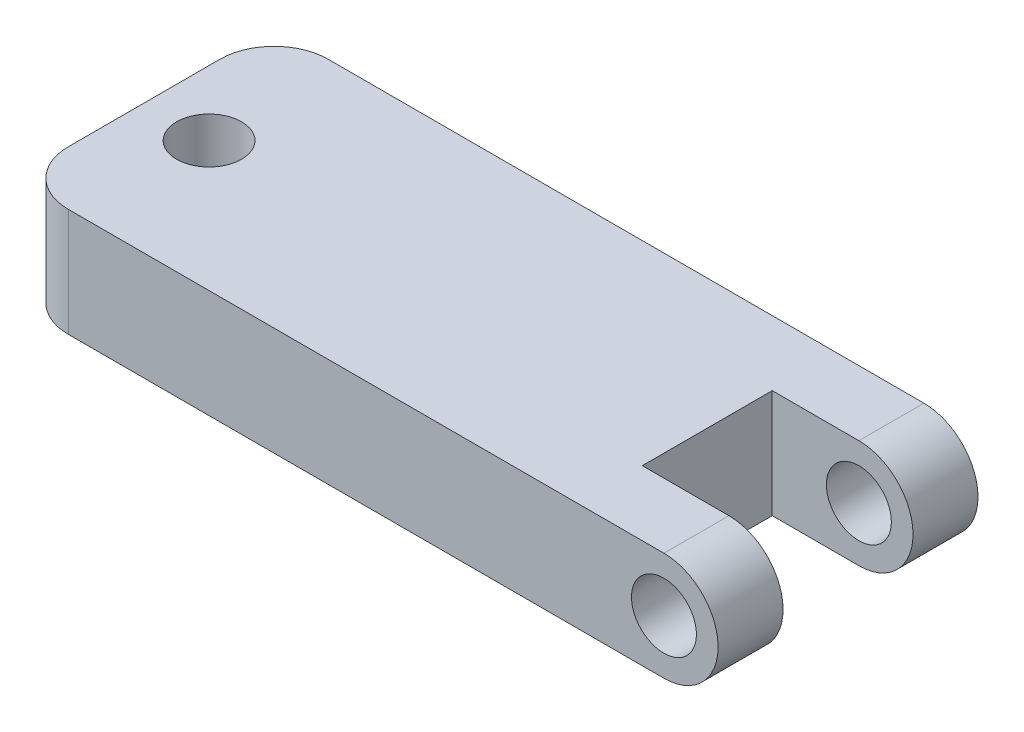
ISO-10303-21;
HEADER;
FILE_DESCRIPTION(('STEP AP214'),'2;1');
FILE_NAME('part.step','',(''),(''),'','','');
FILE_SCHEMA(('AUTOMOTIVE_DESIGN { 1 0 10303 214 1 1 1 1 }'));
ENDSEC;
DATA;
#1=APPLICATION_CONTEXT('core data for automotive mechanical design processes');
#2=APPLICATION_PROTOCOL_DEFINITION('international standard','automotive_design',2000,#1);
#3=PRODUCT_CONTEXT('',#1,'mechanical');
#4=PRODUCT('Part','Part','',(#3));
#5=PRODUCT_RELATED_PRODUCT_CATEGORY('part','',(#4));
#6=PRODUCT_DEFINITION_FORMATION('','',#4);
#7=PRODUCT_DEFINITION_CONTEXT('part definition',#1,'design');
#8=PRODUCT_DEFINITION('design','',#6,#7);
#9=PRODUCT_DEFINITION_SHAPE('','',#8);
#10=(LENGTH_UNIT() NAMED_UNIT(*) SI_UNIT(.MILLI.,.METRE.));
#11=(NAMED_UNIT(*) PLANE_ANGLE_UNIT() SI_UNIT($,.RADIAN.));
#12=(NAMED_UNIT(*) SI_UNIT($,.STERADIAN.) SOLID_ANGLE_UNIT());
#13=UNCERTAINTY_MEASURE_WITH_UNIT(LENGTH_MEASURE(1.E-05),#10,'distance_accuracy_value','');
#14=(GEOMETRIC_REPRESENTATION_CONTEXT(3) GLOBAL_UNCERTAINTY_ASSIGNED_CONTEXT((#13)) GLOBAL_UNIT_ASSIGNED_CONTEXT((#10,
#11,#12)) REPRESENTATION_CONTEXT('',''));
#15=CARTESIAN_POINT('',(0.,0.,0.));
#16=DIRECTION('',(0.,0.,1.));
#17=DIRECTION('',(1.,0.,0.));
#18=AXIS2_PLACEMENT_3D('',#15,#16,#17);
#19=CARTESIAN_POINT('',(30.,2.5,-12.));
#20=DIRECTION('',(0.,0.,1.));
#21=DIRECTION('',(1.,0.,0.));
#22=AXIS2_PLACEMENT_3D('',#19,#20,#21);
#23=CYLINDRICAL_SURFACE('',#22,2.5);
#24=CARTESIAN_POINT('',(30.,2.5,-9.));
#25=DIRECTION('',(0.,0.,-1.));
#26=DIRECTION('',(-1.,0.,0.));
#27=AXIS2_PLACEMENT_3D('',#24,#25,#26);
#28=CIRCLE('',#27,2.5);
#29=CARTESIAN_POINT('',(30.,0.,-9.));
#30=VERTEX_POINT('',#29);
#31=CARTESIAN_POINT('',(30.,5.,-9.));
#32=VERTEX_POINT('',#31);
#33=EDGE_CURVE('E154',#30,#32,#28,.F.);
#34=ORIENTED_EDGE('',*,*,#33,.F.);
#35=DIRECTION('',(0.,0.,1.));
#36=VECTOR('',#35,1.);
#37=CARTESIAN_POINT('',(30.,0.,-12.));
#38=LINE('',#37,#36);
#39=CARTESIAN_POINT('',(30.,0.,-12.));
#40=VERTEX_POINT('',#39);
#41=EDGE_CURVE('E177',#40,#30,#38,.T.);
#42=ORIENTED_EDGE('',*,*,#41,.F.);
#43=CARTESIAN_POINT('',(30.,2.5,-12.));
#44=DIRECTION('',(0.,0.,1.));
#45=DIRECTION('',(1.,0.,0.));
#46=AXIS2_PLACEMENT_3D('',#43,#44,#45);
#47=CIRCLE('',#46,2.5);
#48=CARTESIAN_POINT('',(30.,5.,-12.));
#49=VERTEX_POINT('',#48);
#50=EDGE_CURVE('E159',#40,#49,#47,.T.);
#51=ORIENTED_EDGE('',*,*,#50,.T.);
#52=DIRECTION('',(0.,0.,1.));
#53=VECTOR('',#52,1.);
#54=CARTESIAN_POINT('',(30.,5.,-12.));
#55=LINE('',#54,#53);
#56=EDGE_CURVE('E173',#49,#32,#55,.T.);
#57=ORIENTED_EDGE('',*,*,#56,.T.);
#58=EDGE_LOOP('',(#34,#42,#51,#57));
#59=FACE_BOUND('',#58,.T.);
#60=ADVANCED_FACE('F35',(#59),#23,.T.);
#61=CARTESIAN_POINT('',(0.,5.,-12.));
#62=DIRECTION('',(-1.,0.,0.));
#63=DIRECTION('',(0.,0.,1.));
#64=AXIS2_PLACEMENT_3D('',#61,#62,#63);
#65=PLANE('',#64);
#66=DIRECTION('',(0.,0.,1.));
#67=VECTOR('',#66,1.);
#68=CARTESIAN_POINT('',(0.,5.,-12.));
#69=LINE('',#68,#67);
#70=CARTESIAN_POINT('',(0.,5.,-9.5));
#71=VERTEX_POINT('',#70);
#72=CARTESIAN_POINT('',(0.,5.,-2.5));
#73=VERTEX_POINT('',#72);
#74=EDGE_CURVE('E171',#71,#73,#69,.T.);
#75=ORIENTED_EDGE('',*,*,#74,.F.);
#76=DIRECTION('',(0.,-1.,0.));
#77=VECTOR('',#76,1.);
#78=CARTESIAN_POINT('',(0.,0.,-9.5));
#79=LINE('',#78,#77);
#80=CARTESIAN_POINT('',(0.,0.,-9.5));
#81=VERTEX_POINT('',#80);
#82=EDGE_CURVE('E189',#71,#81,#79,.T.);
#83=ORIENTED_EDGE('',*,*,#82,.T.);
#84=DIRECTION('',(0.,0.,1.));
#85=VECTOR('',#84,1.);
#86=CARTESIAN_POINT('',(0.,0.,-12.));
#87=LINE('',#86,#85);
#88=CARTESIAN_POINT('',(0.,0.,-2.5));
#89=VERTEX_POINT('',#88);
#90=EDGE_CURVE('E165',#81,#89,#87,.T.);
#91=ORIENTED_EDGE('',*,*,#90,.T.);
#92=DIRECTION('',(0.,-1.,0.));
#93=VECTOR('',#92,1.);
#94=CARTESIAN_POINT('',(0.,5.,-2.5));
#95=LINE('',#94,#93);
#96=EDGE_CURVE('E183',#89,#73,#95,.F.);
#97=ORIENTED_EDGE('',*,*,#96,.T.);
#98=EDGE_LOOP('',(#75,#83,#91,#97));
#99=FACE_BOUND('',#98,.T.);
#100=ADVANCED_FACE('F203',(#99),#65,.T.);
#101=CARTESIAN_POINT('',(30.,5.,-12.));
#102=DIRECTION('',(0.,1.,0.));
#103=DIRECTION('',(0.,0.,1.));
#104=AXIS2_PLACEMENT_3D('',#101,#102,#103);
#105=PLANE('',#104);
#106=CARTESIAN_POINT('',(3.,5.,-6.));
#107=DIRECTION('',(0.,1.,0.));
#108=DIRECTION('',(0.,0.,1.));
#109=AXIS2_PLACEMENT_3D('',#106,#107,#108);
#110=CIRCLE('',#109,1.5);
#111=CARTESIAN_POINT('',(3.,5.,-4.5));
#112=VERTEX_POINT('',#111);
#113=EDGE_CURVE('E275',#112,#112,#110,.T.);
#114=ORIENTED_EDGE('',*,*,#113,.F.);
#115=EDGE_LOOP('',(#114));
#116=FACE_BOUND('',#115,.T.);
#117=DIRECTION('',(-1.,0.,0.));
#118=VECTOR('',#117,1.);
#119=CARTESIAN_POINT('',(30.,5.,-12.));
#120=LINE('',#119,#118);
#121=CARTESIAN_POINT('',(2.5,5.,-12.));
#122=VERTEX_POINT('',#121);
#123=EDGE_CURVE('E163',#49,#122,#120,.T.);
#124=ORIENTED_EDGE('',*,*,#123,.T.);
#125=CARTESIAN_POINT('',(2.5,5.,-9.5));
#126=DIRECTION('',(0.,1.,0.));
#127=DIRECTION('',(0.,0.,1.));
#128=AXIS2_PLACEMENT_3D('',#125,#126,#127);
#129=CIRCLE('',#128,2.5);
#130=EDGE_CURVE('E43',#122,#71,#129,.T.);
#131=ORIENTED_EDGE('',*,*,#130,.T.);
#132=ORIENTED_EDGE('',*,*,#74,.T.);
#133=CARTESIAN_POINT('',(2.5,5.,-2.5));
#134=DIRECTION('',(0.,1.,0.));
#135=DIRECTION('',(0.,0.,1.));
#136=AXIS2_PLACEMENT_3D('',#133,#134,#135);
#137=CIRCLE('',#136,2.5);
#138=CARTESIAN_POINT('',(2.5,5.,0.));
#139=VERTEX_POINT('',#138);
#140=EDGE_CURVE('E50',#73,#139,#137,.T.);
#141=ORIENTED_EDGE('',*,*,#140,.T.);
#142=DIRECTION('',(-1.,0.,0.));
#143=VECTOR('',#142,1.);
#144=CARTESIAN_POINT('',(30.,5.,0.));
#145=LINE('',#144,#143);
#146=CARTESIAN_POINT('',(30.,5.,0.));
#147=VERTEX_POINT('',#146);
#148=EDGE_CURVE('E160',#147,#139,#145,.T.);
#149=ORIENTED_EDGE('',*,*,#148,.F.);
#150=CARTESIAN_POINT('',(30.,5.,-3.));
#151=VERTEX_POINT('',#150);
#152=EDGE_CURVE('E176',#151,#147,#55,.T.);
#153=ORIENTED_EDGE('',*,*,#152,.F.);
#154=DIRECTION('',(1.,0.,0.));
#155=VECTOR('',#154,1.);
#156=CARTESIAN_POINT('',(26.,5.,-3.));
#157=LINE('',#156,#155);
#158=CARTESIAN_POINT('',(26.,5.,-3.));
#159=VERTEX_POINT('',#158);
#160=EDGE_CURVE('E144',#159,#151,#157,.T.);
#161=ORIENTED_EDGE('',*,*,#160,.F.);
#162=DIRECTION('',(0.,0.,1.));
#163=VECTOR('',#162,1.);
#164=CARTESIAN_POINT('',(26.,5.,-9.));
#165=LINE('',#164,#163);
#166=CARTESIAN_POINT('',(26.,5.,-9.));
#167=VERTEX_POINT('',#166);
#168=EDGE_CURVE('E124',#167,#159,#165,.T.);
#169=ORIENTED_EDGE('',*,*,#168,.F.);
#170=DIRECTION('',(-1.,0.,0.));
#171=VECTOR('',#170,1.);
#172=CARTESIAN_POINT('',(26.,5.,-9.));
#173=LINE('',#172,#171);
#174=EDGE_CURVE('E142',#32,#167,#173,.T.);
#175=ORIENTED_EDGE('',*,*,#174,.F.);
#176=ORIENTED_EDGE('',*,*,#56,.F.);
#177=EDGE_LOOP('',(#124,#131,#132,#141,#149,#153,#161,#169,#175,#176));
#178=FACE_BOUND('',#177,.T.);
#179=ADVANCED_FACE('F199',(#116,#178),#105,.T.);
#180=CARTESIAN_POINT('',(30.,2.5,-3.));
#181=DIRECTION('',(0.,0.,1.));
#182=DIRECTION('',(1.,0.,0.));
#183=AXIS2_PLACEMENT_3D('',#180,#181,#182);
#184=CIRCLE('',#183,2.5);
#185=CARTESIAN_POINT('',(30.,0.,-3.));
#186=VERTEX_POINT('',#185);
#187=EDGE_CURVE('E133',#151,#186,#184,.F.);
#188=ORIENTED_EDGE('',*,*,#187,.F.);
#189=ORIENTED_EDGE('',*,*,#152,.T.);
#190=CARTESIAN_POINT('',(30.,2.5,0.));
#191=DIRECTION('',(0.,0.,1.));
#192=DIRECTION('',(1.,0.,0.));
#193=AXIS2_PLACEMENT_3D('',#190,#191,#192);
#194=CIRCLE('',#193,2.5);
#195=CARTESIAN_POINT('',(30.,0.,0.));
#196=VERTEX_POINT('',#195);
#197=EDGE_CURVE('E167',#196,#147,#194,.T.);
#198=ORIENTED_EDGE('',*,*,#197,.F.);
#199=EDGE_CURVE('E179',#186,#196,#38,.T.);
#200=ORIENTED_EDGE('',*,*,#199,.F.);
#201=EDGE_LOOP('',(#188,#189,#198,#200));
#202=FACE_BOUND('',#201,.T.);
#203=ADVANCED_FACE('F217',(#202),#23,.T.);
#204=CARTESIAN_POINT('',(0.,0.,-12.));
#205=DIRECTION('',(0.,-1.,0.));
#206=DIRECTION('',(0.,0.,-1.));
#207=AXIS2_PLACEMENT_3D('',#204,#205,#206);
#208=PLANE('',#207);
#209=CARTESIAN_POINT('',(3.,0.,-6.));
#210=DIRECTION('',(0.,1.,0.));
#211=DIRECTION('',(0.,0.,1.));
#212=AXIS2_PLACEMENT_3D('',#209,#210,#211);
#213=CIRCLE('',#212,1.5);
#214=CARTESIAN_POINT('',(3.,0.,-4.5));
#215=VERTEX_POINT('',#214);
#216=EDGE_CURVE('E273',#215,#215,#213,.T.);
#217=ORIENTED_EDGE('',*,*,#216,.T.);
#218=EDGE_LOOP('',(#217));
#219=FACE_BOUND('',#218,.T.);
#220=ORIENTED_EDGE('',*,*,#90,.F.);
#221=CARTESIAN_POINT('',(2.5,0.,-9.5));
#222=DIRECTION('',(0.,-1.,0.));
#223=DIRECTION('',(0.,0.,-1.));
#224=AXIS2_PLACEMENT_3D('',#221,#222,#223);
#225=CIRCLE('',#224,2.5);
#226=CARTESIAN_POINT('',(2.5,0.,-12.));
#227=VERTEX_POINT('',#226);
#228=EDGE_CURVE('E194',#81,#227,#225,.T.);
#229=ORIENTED_EDGE('',*,*,#228,.T.);
#230=DIRECTION('',(1.,0.,0.));
#231=VECTOR('',#230,1.);
#232=CARTESIAN_POINT('',(0.,0.,-12.));
#233=LINE('',#232,#231);
#234=EDGE_CURVE('E157',#227,#40,#233,.T.);
#235=ORIENTED_EDGE('',*,*,#234,.T.);
#236=ORIENTED_EDGE('',*,*,#41,.T.);
#237=DIRECTION('',(1.,0.,0.));
#238=VECTOR('',#237,1.);
#239=CARTESIAN_POINT('',(0.,0.,-9.));
#240=LINE('',#239,#238);
#241=CARTESIAN_POINT('',(26.,0.,-9.));
#242=VERTEX_POINT('',#241);
#243=EDGE_CURVE('E141',#242,#30,#240,.T.);
#244=ORIENTED_EDGE('',*,*,#243,.F.);
#245=DIRECTION('',(0.,0.,1.));
#246=VECTOR('',#245,1.);
#247=CARTESIAN_POINT('',(26.,0.,-9.));
#248=LINE('',#247,#246);
#249=CARTESIAN_POINT('',(26.,0.,-3.));
#250=VERTEX_POINT('',#249);
#251=EDGE_CURVE('E121',#242,#250,#248,.T.);
#252=ORIENTED_EDGE('',*,*,#251,.T.);
#253=DIRECTION('',(1.,0.,0.));
#254=VECTOR('',#253,1.);
#255=CARTESIAN_POINT('',(26.,0.,-3.));
#256=LINE('',#255,#254);
#257=EDGE_CURVE('E129',#250,#186,#256,.T.);
#258=ORIENTED_EDGE('',*,*,#257,.T.);
#259=ORIENTED_EDGE('',*,*,#199,.T.);
#260=DIRECTION('',(1.,0.,0.));
#261=VECTOR('',#260,1.);
#262=CARTESIAN_POINT('',(0.,0.,0.));
#263=LINE('',#262,#261);
#264=CARTESIAN_POINT('',(2.5,0.,0.));
#265=VERTEX_POINT('',#264);
#266=EDGE_CURVE('E156',#265,#196,#263,.T.);
#267=ORIENTED_EDGE('',*,*,#266,.F.);
#268=CARTESIAN_POINT('',(2.5,0.,-2.5));
#269=DIRECTION('',(0.,-1.,0.));
#270=DIRECTION('',(0.,0.,-1.));
#271=AXIS2_PLACEMENT_3D('',#268,#269,#270);
#272=CIRCLE('',#271,2.5);
#273=EDGE_CURVE('E192',#265,#89,#272,.T.);
#274=ORIENTED_EDGE('',*,*,#273,.T.);
#275=EDGE_LOOP('',(#220,#229,#235,#236,#244,#252,#258,#259,#267,#274));
#276=FACE_BOUND('',#275,.T.);
#277=ADVANCED_FACE('F139',(#219,#276),#208,.T.);
#278=CARTESIAN_POINT('',(30.,2.5,-12.));
#279=DIRECTION('',(0.,0.,1.));
#280=DIRECTION('',(1.,0.,0.));
#281=AXIS2_PLACEMENT_3D('',#278,#279,#280);
#282=PLANE('',#281);
#283=CARTESIAN_POINT('',(30.,2.5,-12.));
#284=DIRECTION('',(0.,0.,1.));
#285=DIRECTION('',(1.,0.,0.));
#286=AXIS2_PLACEMENT_3D('',#283,#284,#285);
#287=CIRCLE('',#286,1.5);
#288=CARTESIAN_POINT('',(31.5,2.5,-12.));
#289=VERTEX_POINT('',#288);
#290=EDGE_CURVE('E187',#289,#289,#287,.T.);
#291=ORIENTED_EDGE('',*,*,#290,.T.);
#292=EDGE_LOOP('',(#291));
#293=FACE_BOUND('',#292,.T.);
#294=ORIENTED_EDGE('',*,*,#234,.F.);
#295=DIRECTION('',(0.,-1.,0.));
#296=VECTOR('',#295,1.);
#297=CARTESIAN_POINT('',(2.5,5.,-12.));
#298=LINE('',#297,#296);
#299=EDGE_CURVE('E58',#227,#122,#298,.F.);
#300=ORIENTED_EDGE('',*,*,#299,.T.);
#301=ORIENTED_EDGE('',*,*,#123,.F.);
#302=ORIENTED_EDGE('',*,*,#50,.F.);
#303=EDGE_LOOP('',(#294,#300,#301,#302));
#304=FACE_BOUND('',#303,.T.);
#305=ADVANCED_FACE('F208',(#293,#304),#282,.F.);
#306=CARTESIAN_POINT('',(30.,2.5,0.));
#307=DIRECTION('',(0.,0.,1.));
#308=DIRECTION('',(1.,0.,0.));
#309=AXIS2_PLACEMENT_3D('',#306,#307,#308);
#310=PLANE('',#309);
#311=CARTESIAN_POINT('',(30.,2.5,0.));
#312=DIRECTION('',(0.,0.,1.));
#313=DIRECTION('',(1.,0.,0.));
#314=AXIS2_PLACEMENT_3D('',#311,#312,#313);
#315=CIRCLE('',#314,1.5);
#316=CARTESIAN_POINT('',(31.5,2.5,0.));
#317=VERTEX_POINT('',#316);
#318=EDGE_CURVE('E277',#317,#317,#315,.T.);
#319=ORIENTED_EDGE('',*,*,#318,.F.);
#320=EDGE_LOOP('',(#319));
#321=FACE_BOUND('',#320,.T.);
#322=ORIENTED_EDGE('',*,*,#148,.T.);
#323=DIRECTION('',(0.,-1.,0.));
#324=VECTOR('',#323,1.);
#325=CARTESIAN_POINT('',(2.5,2.5,0.));
#326=LINE('',#325,#324);
#327=EDGE_CURVE('E11',#139,#265,#326,.T.);
#328=ORIENTED_EDGE('',*,*,#327,.T.);
#329=ORIENTED_EDGE('',*,*,#266,.T.);
#330=ORIENTED_EDGE('',*,*,#197,.T.);
#331=EDGE_LOOP('',(#322,#328,#329,#330));
#332=FACE_BOUND('',#331,.T.);
#333=ADVANCED_FACE('F219',(#321,#332),#310,.T.);
#334=CARTESIAN_POINT('',(26.,0.,-9.));
#335=DIRECTION('',(-1.,0.,0.));
#336=DIRECTION('',(0.,0.,1.));
#337=AXIS2_PLACEMENT_3D('',#334,#335,#336);
#338=PLANE('',#337);
#339=ORIENTED_EDGE('',*,*,#168,.T.);
#340=DIRECTION('',(0.,1.,0.));
#341=VECTOR('',#340,1.);
#342=CARTESIAN_POINT('',(26.,0.,-3.));
#343=LINE('',#342,#341);
#344=EDGE_CURVE('E116',#250,#159,#343,.T.);
#345=ORIENTED_EDGE('',*,*,#344,.F.);
#346=ORIENTED_EDGE('',*,*,#251,.F.);
#347=DIRECTION('',(0.,1.,0.));
#348=VECTOR('',#347,1.);
#349=CARTESIAN_POINT('',(26.,0.,-9.));
#350=LINE('',#349,#348);
#351=EDGE_CURVE('E128',#242,#167,#350,.T.);
#352=ORIENTED_EDGE('',*,*,#351,.T.);
#353=EDGE_LOOP('',(#339,#345,#346,#352));
#354=FACE_BOUND('',#353,.T.);
#355=ADVANCED_FACE('F118',(#354),#338,.F.);
#356=CARTESIAN_POINT('',(26.,0.,-9.));
#357=DIRECTION('',(0.,0.,-1.));
#358=DIRECTION('',(-1.,0.,0.));
#359=AXIS2_PLACEMENT_3D('',#356,#357,#358);
#360=PLANE('',#359);
#361=CARTESIAN_POINT('',(30.,2.5,-9.));
#362=DIRECTION('',(0.,0.,-1.));
#363=DIRECTION('',(-1.,0.,0.));
#364=AXIS2_PLACEMENT_3D('',#361,#362,#363);
#365=CIRCLE('',#364,1.5);
#366=CARTESIAN_POINT('',(28.5,2.5,-9.));
#367=VERTEX_POINT('',#366);
#368=EDGE_CURVE('E147',#367,#367,#365,.T.);
#369=ORIENTED_EDGE('',*,*,#368,.T.);
#370=EDGE_LOOP('',(#369));
#371=FACE_BOUND('',#370,.T.);
#372=ORIENTED_EDGE('',*,*,#33,.T.);
#373=ORIENTED_EDGE('',*,*,#174,.T.);
#374=ORIENTED_EDGE('',*,*,#351,.F.);
#375=ORIENTED_EDGE('',*,*,#243,.T.);
#376=EDGE_LOOP('',(#372,#373,#374,#375));
#377=FACE_BOUND('',#376,.T.);
#378=ADVANCED_FACE('F213',(#371,#377),#360,.F.);
#379=CARTESIAN_POINT('',(26.,0.,-3.));
#380=DIRECTION('',(0.,0.,1.));
#381=DIRECTION('',(1.,0.,0.));
#382=AXIS2_PLACEMENT_3D('',#379,#380,#381);
#383=PLANE('',#382);
#384=CARTESIAN_POINT('',(30.,2.5,-3.));
#385=DIRECTION('',(0.,0.,1.));
#386=DIRECTION('',(1.,0.,0.));
#387=AXIS2_PLACEMENT_3D('',#384,#385,#386);
#388=CIRCLE('',#387,1.5);
#389=CARTESIAN_POINT('',(31.5,2.5,-3.));
#390=VERTEX_POINT('',#389);
#391=EDGE_CURVE('E184',#390,#390,#388,.T.);
#392=ORIENTED_EDGE('',*,*,#391,.T.);
#393=EDGE_LOOP('',(#392));
#394=FACE_BOUND('',#393,.T.);
#395=ORIENTED_EDGE('',*,*,#187,.T.);
#396=ORIENTED_EDGE('',*,*,#257,.F.);
#397=ORIENTED_EDGE('',*,*,#344,.T.);
#398=ORIENTED_EDGE('',*,*,#160,.T.);
#399=EDGE_LOOP('',(#395,#396,#397,#398));
#400=FACE_BOUND('',#399,.T.);
#401=ADVANCED_FACE('F132',(#394,#400),#383,.F.);
#402=CARTESIAN_POINT('',(30.,2.5,-12.));
#403=DIRECTION('',(0.,0.,1.));
#404=DIRECTION('',(1.,0.,0.));
#405=AXIS2_PLACEMENT_3D('',#402,#403,#404);
#406=CYLINDRICAL_SURFACE('',#405,1.5);
#407=ORIENTED_EDGE('',*,*,#318,.T.);
#408=EDGE_LOOP('',(#407));
#409=FACE_BOUND('',#408,.T.);
#410=ORIENTED_EDGE('',*,*,#391,.F.);
#411=EDGE_LOOP('',(#410));
#412=FACE_BOUND('',#411,.T.);
#413=ADVANCED_FACE('F257',(#409,#412),#406,.F.);
#414=ORIENTED_EDGE('',*,*,#290,.F.);
#415=EDGE_LOOP('',(#414));
#416=FACE_BOUND('',#415,.T.);
#417=ORIENTED_EDGE('',*,*,#368,.F.);
#418=EDGE_LOOP('',(#417));
#419=FACE_BOUND('',#418,.T.);
#420=ADVANCED_FACE('F262',(#416,#419),#406,.F.);
#421=CARTESIAN_POINT('',(3.,0.,-6.));
#422=DIRECTION('',(0.,1.,0.));
#423=DIRECTION('',(0.,0.,1.));
#424=AXIS2_PLACEMENT_3D('',#421,#422,#423);
#425=CYLINDRICAL_SURFACE('',#424,1.5);
#426=ORIENTED_EDGE('',*,*,#216,.F.);
#427=EDGE_LOOP('',(#426));
#428=FACE_BOUND('',#427,.T.);
#429=ORIENTED_EDGE('',*,*,#113,.T.);
#430=EDGE_LOOP('',(#429));
#431=FACE_BOUND('',#430,.T.);
#432=ADVANCED_FACE('F227',(#428,#431),#425,.F.);
#433=CARTESIAN_POINT('',(2.5,5.,-9.5));
#434=DIRECTION('',(0.,1.,0.));
#435=DIRECTION('',(0.,0.,1.));
#436=AXIS2_PLACEMENT_3D('',#433,#434,#435);
#437=CYLINDRICAL_SURFACE('',#436,2.5);
#438=ORIENTED_EDGE('',*,*,#130,.F.);
#439=ORIENTED_EDGE('',*,*,#299,.F.);
#440=ORIENTED_EDGE('',*,*,#228,.F.);
#441=ORIENTED_EDGE('',*,*,#82,.F.);
#442=EDGE_LOOP('',(#438,#439,#440,#441));
#443=FACE_BOUND('',#442,.T.);
#444=ADVANCED_FACE('F205',(#443),#437,.T.);
#445=CARTESIAN_POINT('',(2.5,2.5,-2.5));
#446=DIRECTION('',(0.,-1.,0.));
#447=DIRECTION('',(0.,0.,-1.));
#448=AXIS2_PLACEMENT_3D('',#445,#446,#447);
#449=CYLINDRICAL_SURFACE('',#448,2.5);
#450=ORIENTED_EDGE('',*,*,#140,.F.);
#451=ORIENTED_EDGE('',*,*,#96,.F.);
#452=ORIENTED_EDGE('',*,*,#273,.F.);
#453=ORIENTED_EDGE('',*,*,#327,.F.);
#454=EDGE_LOOP('',(#450,#451,#452,#453));
#455=FACE_BOUND('',#454,.T.);
#456=ADVANCED_FACE('F37',(#455),#449,.T.);
#457=CLOSED_SHELL('',(#60,#100,#179,#203,#277,#305,#333,#355,#378,#401,#413,#420,#432,#444,#456));
#458=MANIFOLD_SOLID_BREP('B2',#457);
#459=ADVANCED_BREP_SHAPE_REPRESENTATION('',(#18,#458),#14);
#460=SHAPE_DEFINITION_REPRESENTATION(#9,#459);
ENDSEC;
END-ISO-10303-21;
